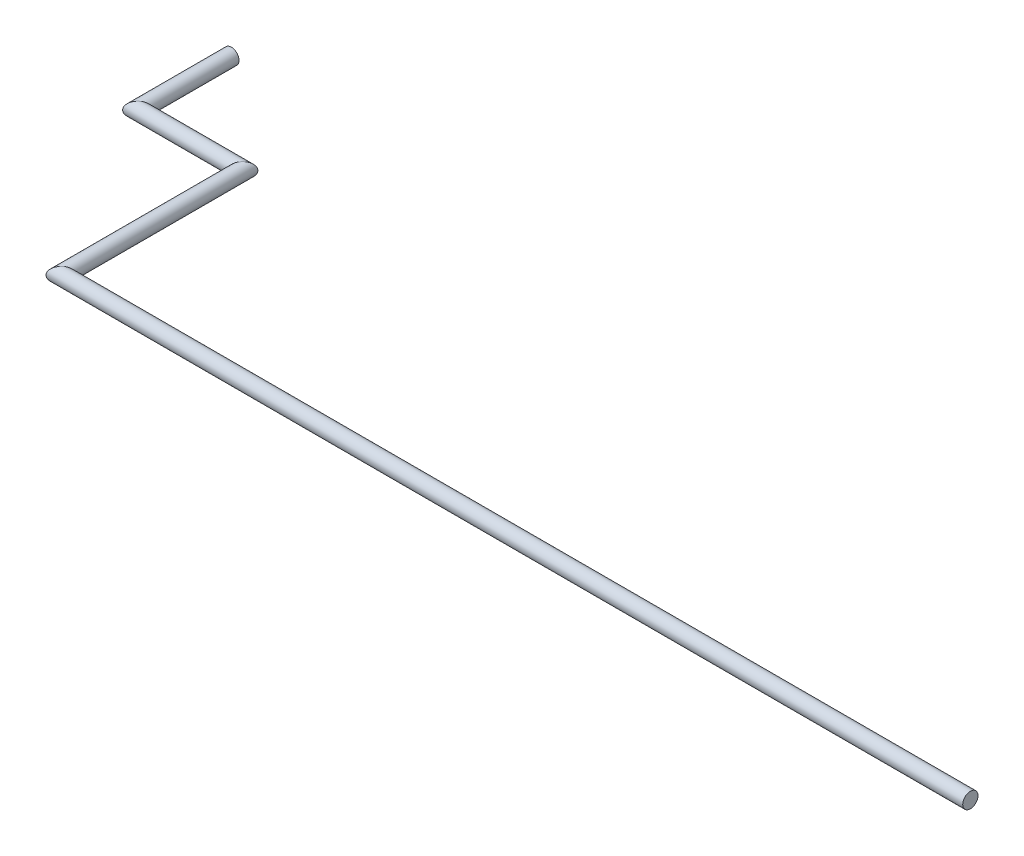
ISO-10303-21;
HEADER;
FILE_DESCRIPTION(('STEP AP214'),'2;1');
FILE_NAME('part.step','',(''),(''),'','','');
FILE_SCHEMA(('AUTOMOTIVE_DESIGN { 1 0 10303 214 1 1 1 1 }'));
ENDSEC;
DATA;
#1=APPLICATION_CONTEXT('core data for automotive mechanical design processes');
#2=APPLICATION_PROTOCOL_DEFINITION('international standard','automotive_design',2000,#1);
#3=PRODUCT_CONTEXT('',#1,'mechanical');
#4=PRODUCT('Part','Part','',(#3));
#5=PRODUCT_RELATED_PRODUCT_CATEGORY('part','',(#4));
#6=PRODUCT_DEFINITION_FORMATION('','',#4);
#7=PRODUCT_DEFINITION_CONTEXT('part definition',#1,'design');
#8=PRODUCT_DEFINITION('design','',#6,#7);
#9=PRODUCT_DEFINITION_SHAPE('','',#8);
#10=(LENGTH_UNIT() NAMED_UNIT(*) SI_UNIT(.MILLI.,.METRE.));
#11=(NAMED_UNIT(*) PLANE_ANGLE_UNIT() SI_UNIT($,.RADIAN.));
#12=(NAMED_UNIT(*) SI_UNIT($,.STERADIAN.) SOLID_ANGLE_UNIT());
#13=UNCERTAINTY_MEASURE_WITH_UNIT(LENGTH_MEASURE(1.E-05),#10,'distance_accuracy_value','');
#14=(GEOMETRIC_REPRESENTATION_CONTEXT(3) GLOBAL_UNCERTAINTY_ASSIGNED_CONTEXT((#13)) GLOBAL_UNIT_ASSIGNED_CONTEXT((#10,
#11,#12)) REPRESENTATION_CONTEXT('',''));
#15=CARTESIAN_POINT('',(0.,0.,0.));
#16=DIRECTION('',(0.,0.,1.));
#17=DIRECTION('',(1.,0.,0.));
#18=AXIS2_PLACEMENT_3D('',#15,#16,#17);
#19=CARTESIAN_POINT('',(-53.9623,0.,-9.65199999999999));
#20=DIRECTION('',(0.,0.,-1.));
#21=DIRECTION('',(-1.,0.,0.));
#22=AXIS2_PLACEMENT_3D('',#19,#20,#21);
#23=CYLINDRICAL_SURFACE('',#22,0.4064);
#24=CARTESIAN_POINT('',(-53.9623,0.,-9.65199999999999));
#25=DIRECTION('',(-0.707106781186548,0.,-0.707106781186548));
#26=DIRECTION('',(-0.707106781186548,0.,0.707106781186548));
#27=AXIS2_PLACEMENT_3D('',#24,#25,#26);
#28=ELLIPSE('',#27,0.574736391748426,0.4064);
#29=CARTESIAN_POINT('',(-54.3687,0.,-9.24559999999999));
#30=VERTEX_POINT('',#29);
#31=EDGE_CURVE('E42',#30,#30,#28,.F.);
#32=ORIENTED_EDGE('',*,*,#31,.F.);
#33=EDGE_LOOP('',(#32));
#34=FACE_BOUND('',#33,.T.);
#35=CARTESIAN_POINT('',(-53.9623,0.,-14.6304));
#36=DIRECTION('',(0.,0.,-1.));
#37=DIRECTION('',(-1.,0.,0.));
#38=AXIS2_PLACEMENT_3D('',#35,#36,#37);
#39=CIRCLE('',#38,0.4064);
#40=CARTESIAN_POINT('',(-54.3687,0.,-14.6304));
#41=VERTEX_POINT('',#40);
#42=EDGE_CURVE('E11',#41,#41,#39,.T.);
#43=ORIENTED_EDGE('',*,*,#42,.F.);
#44=EDGE_LOOP('',(#43));
#45=FACE_BOUND('',#44,.T.);
#46=ADVANCED_FACE('F36',(#34,#45),#23,.T.);
#47=CARTESIAN_POINT('',(-48.387,0.,-9.65199999999999));
#48=DIRECTION('',(-1.,0.,0.));
#49=DIRECTION('',(0.,0.,1.));
#50=AXIS2_PLACEMENT_3D('',#47,#48,#49);
#51=CYLINDRICAL_SURFACE('',#50,0.4064);
#52=CARTESIAN_POINT('',(-48.387,0.,-9.65199999999999));
#53=DIRECTION('',(-0.707106781186548,0.,-0.707106781186548));
#54=DIRECTION('',(0.707106781186548,0.,-0.707106781186548));
#55=AXIS2_PLACEMENT_3D('',#52,#53,#54);
#56=ELLIPSE('',#55,0.574736391748426,0.4064);
#57=CARTESIAN_POINT('',(-47.9806,0.,-10.0584));
#58=VERTEX_POINT('',#57);
#59=EDGE_CURVE('E46',#58,#58,#56,.T.);
#60=ORIENTED_EDGE('',*,*,#59,.T.);
#61=EDGE_LOOP('',(#60));
#62=FACE_BOUND('',#61,.T.);
#63=ORIENTED_EDGE('',*,*,#31,.T.);
#64=EDGE_LOOP('',(#63));
#65=FACE_BOUND('',#64,.T.);
#66=ADVANCED_FACE('F71',(#62,#65),#51,.T.);
#67=CARTESIAN_POINT('',(-48.387,0.,0.));
#68=DIRECTION('',(0.,0.,-1.));
#69=DIRECTION('',(-1.,0.,0.));
#70=AXIS2_PLACEMENT_3D('',#67,#68,#69);
#71=CYLINDRICAL_SURFACE('',#70,0.4064);
#72=CARTESIAN_POINT('',(-48.387,0.,0.));
#73=DIRECTION('',(-0.707106781186548,0.,-0.707106781186547));
#74=DIRECTION('',(0.707106781186547,0.,-0.707106781186548));
#75=AXIS2_PLACEMENT_3D('',#72,#73,#74);
#76=ELLIPSE('',#75,0.574736391748426,0.4064);
#77=CARTESIAN_POINT('',(-47.9806,0.,-0.406399999999994));
#78=VERTEX_POINT('',#77);
#79=EDGE_CURVE('E50',#78,#78,#76,.F.);
#80=ORIENTED_EDGE('',*,*,#79,.F.);
#81=EDGE_LOOP('',(#80));
#82=FACE_BOUND('',#81,.T.);
#83=ORIENTED_EDGE('',*,*,#59,.F.);
#84=EDGE_LOOP('',(#83));
#85=FACE_BOUND('',#84,.T.);
#86=ADVANCED_FACE('F68',(#82,#85),#71,.T.);
#87=CARTESIAN_POINT('',(0.,0.,0.));
#88=DIRECTION('',(1.,0.,0.));
#89=DIRECTION('',(0.,0.,-1.));
#90=AXIS2_PLACEMENT_3D('',#87,#88,#89);
#91=PLANE('',#90);
#92=CARTESIAN_POINT('',(0.,0.,0.));
#93=DIRECTION('',(1.,0.,0.));
#94=DIRECTION('',(0.,0.,-1.));
#95=AXIS2_PLACEMENT_3D('',#92,#93,#94);
#96=CIRCLE('',#95,0.4064);
#97=CARTESIAN_POINT('',(0.,0.,-0.4064));
#98=VERTEX_POINT('',#97);
#99=EDGE_CURVE('E55',#98,#98,#96,.T.);
#100=ORIENTED_EDGE('',*,*,#99,.T.);
#101=EDGE_LOOP('',(#100));
#102=FACE_BOUND('',#101,.T.);
#103=ADVANCED_FACE('F59',(#102),#91,.T.);
#104=CARTESIAN_POINT('',(-49.5364727834968,0.,0.));
#105=DIRECTION('',(1.,0.,0.));
#106=DIRECTION('',(0.,0.,-1.));
#107=AXIS2_PLACEMENT_3D('',#104,#105,#106);
#108=CYLINDRICAL_SURFACE('',#107,0.4064);
#109=ORIENTED_EDGE('',*,*,#99,.F.);
#110=EDGE_LOOP('',(#109));
#111=FACE_BOUND('',#110,.T.);
#112=ORIENTED_EDGE('',*,*,#79,.T.);
#113=EDGE_LOOP('',(#112));
#114=FACE_BOUND('',#113,.T.);
#115=ADVANCED_FACE('F61',(#111,#114),#108,.T.);
#116=CARTESIAN_POINT('',(-53.9623,0.,-14.6304));
#117=DIRECTION('',(0.,0.,-1.));
#118=DIRECTION('',(-1.,0.,0.));
#119=AXIS2_PLACEMENT_3D('',#116,#117,#118);
#120=PLANE('',#119);
#121=ORIENTED_EDGE('',*,*,#42,.T.);
#122=EDGE_LOOP('',(#121));
#123=FACE_BOUND('',#122,.T.);
#124=ADVANCED_FACE('F64',(#123),#120,.T.);
#125=CLOSED_SHELL('',(#46,#66,#86,#103,#115,#124));
#126=MANIFOLD_SOLID_BREP('B2',#125);
#127=ADVANCED_BREP_SHAPE_REPRESENTATION('',(#18,#126),#14);
#128=SHAPE_DEFINITION_REPRESENTATION(#9,#127);
ENDSEC;
END-ISO-10303-21;
